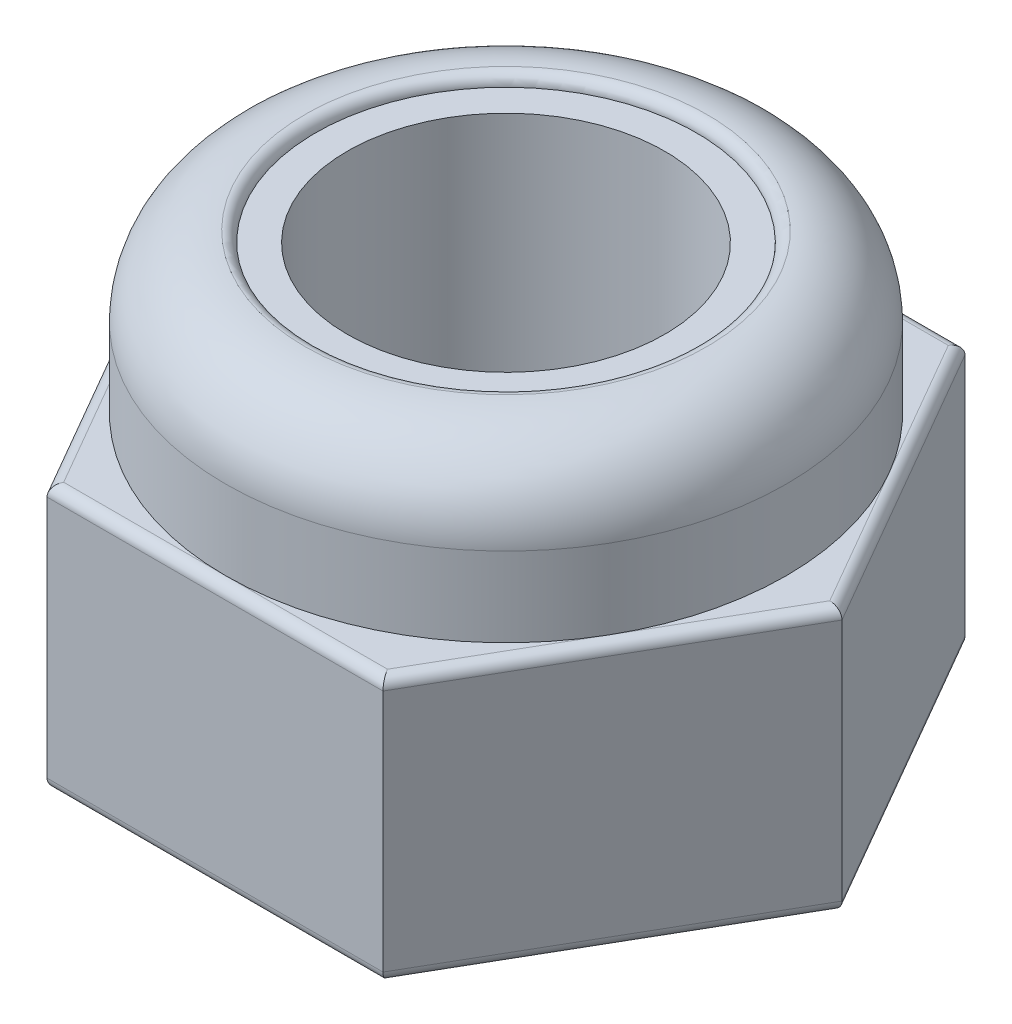
ISO-10303-21;
HEADER;
FILE_DESCRIPTION(('STEP AP214'),'2;1');
FILE_NAME('part.step','',(''),(''),'','','');
FILE_SCHEMA(('AUTOMOTIVE_DESIGN { 1 0 10303 214 1 1 1 1 }'));
ENDSEC;
DATA;
#1=APPLICATION_CONTEXT('core data for automotive mechanical design processes');
#2=APPLICATION_PROTOCOL_DEFINITION('international standard','automotive_design',2000,#1);
#3=PRODUCT_CONTEXT('',#1,'mechanical');
#4=PRODUCT('Part','Part','',(#3));
#5=PRODUCT_RELATED_PRODUCT_CATEGORY('part','',(#4));
#6=PRODUCT_DEFINITION_FORMATION('','',#4);
#7=PRODUCT_DEFINITION_CONTEXT('part definition',#1,'design');
#8=PRODUCT_DEFINITION('design','',#6,#7);
#9=PRODUCT_DEFINITION_SHAPE('','',#8);
#10=(LENGTH_UNIT() NAMED_UNIT(*) SI_UNIT(.MILLI.,.METRE.));
#11=(NAMED_UNIT(*) PLANE_ANGLE_UNIT() SI_UNIT($,.RADIAN.));
#12=(NAMED_UNIT(*) SI_UNIT($,.STERADIAN.) SOLID_ANGLE_UNIT());
#13=UNCERTAINTY_MEASURE_WITH_UNIT(LENGTH_MEASURE(1.E-05),#10,'distance_accuracy_value','');
#14=(GEOMETRIC_REPRESENTATION_CONTEXT(3) GLOBAL_UNCERTAINTY_ASSIGNED_CONTEXT((#13)) GLOBAL_UNIT_ASSIGNED_CONTEXT((#10,
#11,#12)) REPRESENTATION_CONTEXT('',''));
#15=CARTESIAN_POINT('',(0.,0.,0.));
#16=DIRECTION('',(0.,0.,1.));
#17=DIRECTION('',(1.,0.,0.));
#18=AXIS2_PLACEMENT_3D('',#15,#16,#17);
#19=CARTESIAN_POINT('',(0.,4.,0.));
#20=DIRECTION('',(0.,-1.,0.));
#21=DIRECTION('',(0.,0.,-1.));
#22=AXIS2_PLACEMENT_3D('',#19,#20,#21);
#23=CYLINDRICAL_SURFACE('',#22,1.5);
#24=CARTESIAN_POINT('',(0.,0.0999999999999998,0.));
#25=DIRECTION('',(0.,1.,0.));
#26=DIRECTION('',(0.,0.,1.));
#27=AXIS2_PLACEMENT_3D('',#24,#25,#26);
#28=CIRCLE('',#27,1.5);
#29=CARTESIAN_POINT('',(0.,0.0999999999999998,1.5));
#30=VERTEX_POINT('',#29);
#31=EDGE_CURVE('E172',#30,#30,#28,.F.);
#32=ORIENTED_EDGE('',*,*,#31,.T.);
#33=EDGE_LOOP('',(#32));
#34=FACE_BOUND('',#33,.T.);
#35=CARTESIAN_POINT('',(0.,3.9,0.));
#36=DIRECTION('',(0.,1.,0.));
#37=DIRECTION('',(0.,0.,1.));
#38=AXIS2_PLACEMENT_3D('',#35,#36,#37);
#39=CIRCLE('',#38,1.5);
#40=CARTESIAN_POINT('',(0.,3.9,1.5));
#41=VERTEX_POINT('',#40);
#42=EDGE_CURVE('E629',#41,#41,#39,.T.);
#43=ORIENTED_EDGE('',*,*,#42,.T.);
#44=EDGE_LOOP('',(#43));
#45=FACE_BOUND('',#44,.T.);
#46=ADVANCED_FACE('F33',(#34,#45),#23,.F.);
#47=CARTESIAN_POINT('',(0.,2.5,2.65));
#48=DIRECTION('',(0.,-1.,0.));
#49=DIRECTION('',(0.,0.,-1.));
#50=AXIS2_PLACEMENT_3D('',#47,#48,#49);
#51=PLANE('',#50);
#52=DIRECTION('',(-1.,0.,0.));
#53=VECTOR('',#52,1.);
#54=CARTESIAN_POINT('',(0.,2.5,2.65));
#55=LINE('',#54,#53);
#56=CARTESIAN_POINT('',(0.,2.5,2.65));
#57=VERTEX_POINT('',#56);
#58=CARTESIAN_POINT('',(1.52997821335251,2.5,2.65));
#59=VERTEX_POINT('',#58);
#60=EDGE_CURVE('E49',#57,#59,#55,.F.);
#61=ORIENTED_EDGE('',*,*,#60,.T.);
#62=DIRECTION('',(-0.5,0.,0.866025403784439));
#63=VECTOR('',#62,1.);
#64=CARTESIAN_POINT('',(1.14748366001438,2.5,3.3125));
#65=LINE('',#64,#63);
#66=CARTESIAN_POINT('',(2.29496732002876,2.5,1.325));
#67=VERTEX_POINT('',#66);
#68=EDGE_CURVE('E11',#59,#67,#65,.F.);
#69=ORIENTED_EDGE('',*,*,#68,.T.);
#70=CARTESIAN_POINT('',(0.,2.5,0.));
#71=DIRECTION('',(0.,1.,0.));
#72=DIRECTION('',(0.,0.,1.));
#73=AXIS2_PLACEMENT_3D('',#70,#71,#72);
#74=CIRCLE('',#73,2.65);
#75=EDGE_CURVE('E274',#57,#67,#74,.T.);
#76=ORIENTED_EDGE('',*,*,#75,.F.);
#77=EDGE_LOOP('',(#61,#69,#76));
#78=FACE_BOUND('',#77,.T.);
#79=ADVANCED_FACE('F279',(#78),#51,.F.);
#80=CARTESIAN_POINT('',(2.29496732002876,2.5,-1.325));
#81=VERTEX_POINT('',#80);
#82=EDGE_CURVE('E281',#67,#81,#74,.T.);
#83=ORIENTED_EDGE('',*,*,#82,.F.);
#84=DIRECTION('',(-0.5,0.,0.866025403784439));
#85=VECTOR('',#84,1.);
#86=CARTESIAN_POINT('',(1.14748366001438,2.5,3.3125));
#87=LINE('',#86,#85);
#88=CARTESIAN_POINT('',(3.05995642670502,2.5,0.));
#89=VERTEX_POINT('',#88);
#90=EDGE_CURVE('E42',#67,#89,#87,.F.);
#91=ORIENTED_EDGE('',*,*,#90,.T.);
#92=DIRECTION('',(0.5,0.,0.866025403784439));
#93=VECTOR('',#92,1.);
#94=CARTESIAN_POINT('',(3.44245098004314,2.5,0.6625));
#95=LINE('',#94,#93);
#96=EDGE_CURVE('E221',#89,#81,#95,.F.);
#97=ORIENTED_EDGE('',*,*,#96,.T.);
#98=EDGE_LOOP('',(#83,#91,#97));
#99=FACE_BOUND('',#98,.T.);
#100=ADVANCED_FACE('F348',(#99),#51,.F.);
#101=CARTESIAN_POINT('',(0.,2.5,-2.65));
#102=VERTEX_POINT('',#101);
#103=EDGE_CURVE('E285',#81,#102,#74,.T.);
#104=ORIENTED_EDGE('',*,*,#103,.F.);
#105=DIRECTION('',(0.5,0.,0.866025403784439));
#106=VECTOR('',#105,1.);
#107=CARTESIAN_POINT('',(3.44245098004314,2.5,0.6625));
#108=LINE('',#107,#106);
#109=CARTESIAN_POINT('',(1.52997821335251,2.5,-2.65));
#110=VERTEX_POINT('',#109);
#111=EDGE_CURVE('E219',#81,#110,#108,.F.);
#112=ORIENTED_EDGE('',*,*,#111,.T.);
#113=DIRECTION('',(1.,0.,0.));
#114=VECTOR('',#113,1.);
#115=CARTESIAN_POINT('',(0.,2.5,-2.65));
#116=LINE('',#115,#114);
#117=EDGE_CURVE('E216',#110,#102,#116,.F.);
#118=ORIENTED_EDGE('',*,*,#117,.T.);
#119=EDGE_LOOP('',(#104,#112,#118));
#120=FACE_BOUND('',#119,.T.);
#121=ADVANCED_FACE('F341',(#120),#51,.F.);
#122=CARTESIAN_POINT('',(-2.29496732002876,2.5,-1.325));
#123=VERTEX_POINT('',#122);
#124=EDGE_CURVE('E344',#102,#123,#74,.T.);
#125=ORIENTED_EDGE('',*,*,#124,.F.);
#126=DIRECTION('',(1.,0.,0.));
#127=VECTOR('',#126,1.);
#128=CARTESIAN_POINT('',(0.,2.5,-2.65));
#129=LINE('',#128,#127);
#130=CARTESIAN_POINT('',(-1.52997821335251,2.5,-2.65));
#131=VERTEX_POINT('',#130);
#132=EDGE_CURVE('E214',#102,#131,#129,.F.);
#133=ORIENTED_EDGE('',*,*,#132,.T.);
#134=DIRECTION('',(0.5,0.,-0.866025403784439));
#135=VECTOR('',#134,1.);
#136=CARTESIAN_POINT('',(-3.44245098004314,2.5,0.6625));
#137=LINE('',#136,#135);
#138=EDGE_CURVE('E210',#131,#123,#137,.F.);
#139=ORIENTED_EDGE('',*,*,#138,.T.);
#140=EDGE_LOOP('',(#125,#133,#139));
#141=FACE_BOUND('',#140,.T.);
#142=ADVANCED_FACE('F345',(#141),#51,.F.);
#143=DIRECTION('',(-0.5,0.,-0.866025403784439));
#144=VECTOR('',#143,1.);
#145=CARTESIAN_POINT('',(-1.14748366001438,2.5,3.3125));
#146=LINE('',#145,#144);
#147=CARTESIAN_POINT('',(-2.29496732002876,2.5,1.325));
#148=VERTEX_POINT('',#147);
#149=CARTESIAN_POINT('',(-1.52997821335251,2.5,2.65));
#150=VERTEX_POINT('',#149);
#151=EDGE_CURVE('E204',#148,#150,#146,.F.);
#152=ORIENTED_EDGE('',*,*,#151,.T.);
#153=DIRECTION('',(-1.,0.,0.));
#154=VECTOR('',#153,1.);
#155=CARTESIAN_POINT('',(0.,2.5,2.65));
#156=LINE('',#155,#154);
#157=EDGE_CURVE('E212',#150,#57,#156,.F.);
#158=ORIENTED_EDGE('',*,*,#157,.T.);
#159=EDGE_CURVE('E268',#148,#57,#74,.T.);
#160=ORIENTED_EDGE('',*,*,#159,.F.);
#161=EDGE_LOOP('',(#152,#158,#160));
#162=FACE_BOUND('',#161,.T.);
#163=ADVANCED_FACE('F267',(#162),#51,.F.);
#164=CARTESIAN_POINT('',(0.,0.,0.));
#165=DIRECTION('',(0.,1.,0.));
#166=DIRECTION('',(0.,0.,1.));
#167=AXIS2_PLACEMENT_3D('',#164,#165,#166);
#168=PLANE('',#167);
#169=CARTESIAN_POINT('',(0.,0.,0.));
#170=DIRECTION('',(0.,1.,0.));
#171=DIRECTION('',(0.,0.,1.));
#172=AXIS2_PLACEMENT_3D('',#169,#170,#171);
#173=CIRCLE('',#172,1.6);
#174=CARTESIAN_POINT('',(0.,0.,1.6));
#175=VERTEX_POINT('',#174);
#176=EDGE_CURVE('E169',#175,#175,#173,.T.);
#177=ORIENTED_EDGE('',*,*,#176,.T.);
#178=EDGE_LOOP('',(#177));
#179=FACE_BOUND('',#178,.T.);
#180=DIRECTION('',(-0.5,0.,-0.866025403784439));
#181=VECTOR('',#180,1.);
#182=CARTESIAN_POINT('',(2.29496732002876,0.,-1.325));
#183=LINE('',#182,#181);
#184=CARTESIAN_POINT('',(1.52997821335251,0.,-2.65));
#185=VERTEX_POINT('',#184);
#186=CARTESIAN_POINT('',(3.05995642670502,0.,0.));
#187=VERTEX_POINT('',#186);
#188=EDGE_CURVE('E168',#185,#187,#183,.F.);
#189=ORIENTED_EDGE('',*,*,#188,.T.);
#190=DIRECTION('',(0.5,0.,-0.866025403784439));
#191=VECTOR('',#190,1.);
#192=CARTESIAN_POINT('',(2.29496732002876,0.,1.325));
#193=LINE('',#192,#191);
#194=CARTESIAN_POINT('',(1.52997821335251,0.,2.65));
#195=VERTEX_POINT('',#194);
#196=EDGE_CURVE('E147',#187,#195,#193,.F.);
#197=ORIENTED_EDGE('',*,*,#196,.T.);
#198=DIRECTION('',(1.,0.,0.));
#199=VECTOR('',#198,1.);
#200=CARTESIAN_POINT('',(0.,0.,2.65));
#201=LINE('',#200,#199);
#202=CARTESIAN_POINT('',(-1.52997821335251,0.,2.65));
#203=VERTEX_POINT('',#202);
#204=EDGE_CURVE('E157',#195,#203,#201,.F.);
#205=ORIENTED_EDGE('',*,*,#204,.T.);
#206=DIRECTION('',(0.5,0.,0.866025403784439));
#207=VECTOR('',#206,1.);
#208=CARTESIAN_POINT('',(-2.29496732002876,0.,1.325));
#209=LINE('',#208,#207);
#210=CARTESIAN_POINT('',(-3.05995642670502,0.,0.));
#211=VERTEX_POINT('',#210);
#212=EDGE_CURVE('E163',#203,#211,#209,.F.);
#213=ORIENTED_EDGE('',*,*,#212,.T.);
#214=DIRECTION('',(-0.5,0.,0.866025403784439));
#215=VECTOR('',#214,1.);
#216=CARTESIAN_POINT('',(-2.29496732002876,0.,-1.325));
#217=LINE('',#216,#215);
#218=CARTESIAN_POINT('',(-1.52997821335251,0.,-2.65));
#219=VERTEX_POINT('',#218);
#220=EDGE_CURVE('E306',#211,#219,#217,.F.);
#221=ORIENTED_EDGE('',*,*,#220,.T.);
#222=DIRECTION('',(-1.,0.,0.));
#223=VECTOR('',#222,1.);
#224=CARTESIAN_POINT('',(0.,0.,-2.65));
#225=LINE('',#224,#223);
#226=EDGE_CURVE('E174',#219,#185,#225,.F.);
#227=ORIENTED_EDGE('',*,*,#226,.T.);
#228=EDGE_LOOP('',(#189,#197,#205,#213,#221,#227));
#229=FACE_BOUND('',#228,.T.);
#230=ADVANCED_FACE('F166',(#179,#229),#168,.F.);
#231=CARTESIAN_POINT('',(-1.58771324027147,4.,2.75));
#232=DIRECTION('',(0.,0.,-1.));
#233=DIRECTION('',(-1.,0.,0.));
#234=AXIS2_PLACEMENT_3D('',#231,#232,#233);
#235=PLANE('',#234);
#236=DIRECTION('',(0.,-1.,0.));
#237=VECTOR('',#236,1.);
#238=CARTESIAN_POINT('',(-1.58771324027147,4.,2.75));
#239=LINE('',#238,#237);
#240=CARTESIAN_POINT('',(-1.58771324027147,2.4,2.75));
#241=VERTEX_POINT('',#240);
#242=CARTESIAN_POINT('',(-1.58771324027147,0.0999999999999998,2.75));
#243=VERTEX_POINT('',#242);
#244=EDGE_CURVE('E283',#241,#243,#239,.T.);
#245=ORIENTED_EDGE('',*,*,#244,.T.);
#246=DIRECTION('',(1.,0.,0.));
#247=VECTOR('',#246,1.);
#248=CARTESIAN_POINT('',(-1.58771324027147,0.0999999999999998,2.75));
#249=LINE('',#248,#247);
#250=CARTESIAN_POINT('',(1.58771324027147,0.0999999999999998,2.75));
#251=VERTEX_POINT('',#250);
#252=EDGE_CURVE('E202',#243,#251,#249,.T.);
#253=ORIENTED_EDGE('',*,*,#252,.T.);
#254=DIRECTION('',(0.,-1.,0.));
#255=VECTOR('',#254,1.);
#256=CARTESIAN_POINT('',(1.58771324027147,4.,2.75));
#257=LINE('',#256,#255);
#258=CARTESIAN_POINT('',(1.58771324027147,2.4,2.75));
#259=VERTEX_POINT('',#258);
#260=EDGE_CURVE('E164',#259,#251,#257,.T.);
#261=ORIENTED_EDGE('',*,*,#260,.F.);
#262=DIRECTION('',(-1.,0.,0.));
#263=VECTOR('',#262,1.);
#264=CARTESIAN_POINT('',(-1.58771324027147,2.4,2.75));
#265=LINE('',#264,#263);
#266=EDGE_CURVE('E200',#259,#241,#265,.T.);
#267=ORIENTED_EDGE('',*,*,#266,.T.);
#268=EDGE_LOOP('',(#245,#253,#261,#267));
#269=FACE_BOUND('',#268,.T.);
#270=ADVANCED_FACE('F370',(#269),#235,.F.);
#271=CARTESIAN_POINT('',(1.58771324027147,4.,2.75));
#272=DIRECTION('',(-0.866025403784439,0.,-0.5));
#273=DIRECTION('',(-0.5,0.,0.866025403784439));
#274=AXIS2_PLACEMENT_3D('',#271,#272,#273);
#275=PLANE('',#274);
#276=ORIENTED_EDGE('',*,*,#260,.T.);
#277=DIRECTION('',(0.5,0.,-0.866025403784439));
#278=VECTOR('',#277,1.);
#279=CARTESIAN_POINT('',(1.58771324027147,0.0999999999999998,2.75));
#280=LINE('',#279,#278);
#281=CARTESIAN_POINT('',(3.17542648054294,0.0999999999999998,0.));
#282=VERTEX_POINT('',#281);
#283=EDGE_CURVE('E150',#251,#282,#280,.T.);
#284=ORIENTED_EDGE('',*,*,#283,.T.);
#285=DIRECTION('',(0.,-1.,0.));
#286=VECTOR('',#285,1.);
#287=CARTESIAN_POINT('',(3.17542648054294,4.,0.));
#288=LINE('',#287,#286);
#289=CARTESIAN_POINT('',(3.17542648054294,2.4,0.));
#290=VERTEX_POINT('',#289);
#291=EDGE_CURVE('E300',#290,#282,#288,.T.);
#292=ORIENTED_EDGE('',*,*,#291,.F.);
#293=DIRECTION('',(-0.5,0.,0.866025403784439));
#294=VECTOR('',#293,1.);
#295=CARTESIAN_POINT('',(1.58771324027147,2.4,2.75));
#296=LINE('',#295,#294);
#297=EDGE_CURVE('E180',#290,#259,#296,.T.);
#298=ORIENTED_EDGE('',*,*,#297,.T.);
#299=EDGE_LOOP('',(#276,#284,#292,#298));
#300=FACE_BOUND('',#299,.T.);
#301=ADVANCED_FACE('F321',(#300),#275,.F.);
#302=CARTESIAN_POINT('',(3.17542648054294,4.,0.));
#303=DIRECTION('',(-0.866025403784439,0.,0.5));
#304=DIRECTION('',(0.5,0.,0.866025403784439));
#305=AXIS2_PLACEMENT_3D('',#302,#303,#304);
#306=PLANE('',#305);
#307=ORIENTED_EDGE('',*,*,#291,.T.);
#308=DIRECTION('',(-0.5,0.,-0.866025403784439));
#309=VECTOR('',#308,1.);
#310=CARTESIAN_POINT('',(3.17542648054294,0.0999999999999998,0.));
#311=LINE('',#310,#309);
#312=CARTESIAN_POINT('',(1.58771324027147,0.0999999999999998,-2.75));
#313=VERTEX_POINT('',#312);
#314=EDGE_CURVE('E185',#282,#313,#311,.T.);
#315=ORIENTED_EDGE('',*,*,#314,.T.);
#316=DIRECTION('',(0.,-1.,0.));
#317=VECTOR('',#316,1.);
#318=CARTESIAN_POINT('',(1.58771324027147,4.,-2.75));
#319=LINE('',#318,#317);
#320=CARTESIAN_POINT('',(1.58771324027147,2.4,-2.75));
#321=VERTEX_POINT('',#320);
#322=EDGE_CURVE('E297',#321,#313,#319,.T.);
#323=ORIENTED_EDGE('',*,*,#322,.F.);
#324=DIRECTION('',(0.5,0.,0.866025403784439));
#325=VECTOR('',#324,1.);
#326=CARTESIAN_POINT('',(3.17542648054294,2.4,0.));
#327=LINE('',#326,#325);
#328=EDGE_CURVE('E183',#321,#290,#327,.T.);
#329=ORIENTED_EDGE('',*,*,#328,.T.);
#330=EDGE_LOOP('',(#307,#315,#323,#329));
#331=FACE_BOUND('',#330,.T.);
#332=ADVANCED_FACE('F323',(#331),#306,.F.);
#333=CARTESIAN_POINT('',(1.58771324027147,4.,-2.75));
#334=DIRECTION('',(0.,0.,1.));
#335=DIRECTION('',(1.,0.,0.));
#336=AXIS2_PLACEMENT_3D('',#333,#334,#335);
#337=PLANE('',#336);
#338=ORIENTED_EDGE('',*,*,#322,.T.);
#339=DIRECTION('',(-1.,0.,0.));
#340=VECTOR('',#339,1.);
#341=CARTESIAN_POINT('',(1.58771324027147,0.0999999999999998,-2.75));
#342=LINE('',#341,#340);
#343=CARTESIAN_POINT('',(-1.58771324027147,0.0999999999999998,-2.75));
#344=VERTEX_POINT('',#343);
#345=EDGE_CURVE('E190',#313,#344,#342,.T.);
#346=ORIENTED_EDGE('',*,*,#345,.T.);
#347=DIRECTION('',(0.,-1.,0.));
#348=VECTOR('',#347,1.);
#349=CARTESIAN_POINT('',(-1.58771324027147,4.,-2.75));
#350=LINE('',#349,#348);
#351=CARTESIAN_POINT('',(-1.58771324027147,2.4,-2.75));
#352=VERTEX_POINT('',#351);
#353=EDGE_CURVE('E294',#352,#344,#350,.T.);
#354=ORIENTED_EDGE('',*,*,#353,.F.);
#355=DIRECTION('',(1.,0.,0.));
#356=VECTOR('',#355,1.);
#357=CARTESIAN_POINT('',(1.58771324027147,2.4,-2.75));
#358=LINE('',#357,#356);
#359=EDGE_CURVE('E187',#352,#321,#358,.T.);
#360=ORIENTED_EDGE('',*,*,#359,.T.);
#361=EDGE_LOOP('',(#338,#346,#354,#360));
#362=FACE_BOUND('',#361,.T.);
#363=ADVANCED_FACE('F333',(#362),#337,.F.);
#364=CARTESIAN_POINT('',(-1.58771324027147,4.,-2.75));
#365=DIRECTION('',(0.866025403784439,0.,0.5));
#366=DIRECTION('',(0.5,0.,-0.866025403784439));
#367=AXIS2_PLACEMENT_3D('',#364,#365,#366);
#368=PLANE('',#367);
#369=ORIENTED_EDGE('',*,*,#353,.T.);
#370=DIRECTION('',(-0.5,0.,0.866025403784439));
#371=VECTOR('',#370,1.);
#372=CARTESIAN_POINT('',(-1.58771324027147,0.0999999999999998,-2.75));
#373=LINE('',#372,#371);
#374=CARTESIAN_POINT('',(-3.17542648054294,0.0999999999999998,0.));
#375=VERTEX_POINT('',#374);
#376=EDGE_CURVE('E194',#344,#375,#373,.T.);
#377=ORIENTED_EDGE('',*,*,#376,.T.);
#378=DIRECTION('',(0.,-1.,0.));
#379=VECTOR('',#378,1.);
#380=CARTESIAN_POINT('',(-3.17542648054294,4.,0.));
#381=LINE('',#380,#379);
#382=CARTESIAN_POINT('',(-3.17542648054294,2.4,0.));
#383=VERTEX_POINT('',#382);
#384=EDGE_CURVE('E291',#383,#375,#381,.T.);
#385=ORIENTED_EDGE('',*,*,#384,.F.);
#386=DIRECTION('',(0.5,0.,-0.866025403784439));
#387=VECTOR('',#386,1.);
#388=CARTESIAN_POINT('',(-1.58771324027147,2.4,-2.75));
#389=LINE('',#388,#387);
#390=EDGE_CURVE('E192',#383,#352,#389,.T.);
#391=ORIENTED_EDGE('',*,*,#390,.T.);
#392=EDGE_LOOP('',(#369,#377,#385,#391));
#393=FACE_BOUND('',#392,.T.);
#394=ADVANCED_FACE('F375',(#393),#368,.F.);
#395=CARTESIAN_POINT('',(-3.17542648054294,4.,0.));
#396=DIRECTION('',(0.866025403784439,0.,-0.5));
#397=DIRECTION('',(-0.5,0.,-0.866025403784439));
#398=AXIS2_PLACEMENT_3D('',#395,#396,#397);
#399=PLANE('',#398);
#400=ORIENTED_EDGE('',*,*,#384,.T.);
#401=DIRECTION('',(0.5,0.,0.866025403784439));
#402=VECTOR('',#401,1.);
#403=CARTESIAN_POINT('',(-3.17542648054294,0.0999999999999998,0.));
#404=LINE('',#403,#402);
#405=EDGE_CURVE('E198',#375,#243,#404,.T.);
#406=ORIENTED_EDGE('',*,*,#405,.T.);
#407=ORIENTED_EDGE('',*,*,#244,.F.);
#408=DIRECTION('',(-0.5,0.,-0.866025403784439));
#409=VECTOR('',#408,1.);
#410=CARTESIAN_POINT('',(-3.17542648054294,2.4,0.));
#411=LINE('',#410,#409);
#412=EDGE_CURVE('E196',#241,#383,#411,.T.);
#413=ORIENTED_EDGE('',*,*,#412,.T.);
#414=EDGE_LOOP('',(#400,#406,#407,#413));
#415=FACE_BOUND('',#414,.T.);
#416=ADVANCED_FACE('F372',(#415),#399,.F.);
#417=EDGE_CURVE('E277',#123,#148,#74,.T.);
#418=ORIENTED_EDGE('',*,*,#417,.F.);
#419=DIRECTION('',(0.5,0.,-0.866025403784439));
#420=VECTOR('',#419,1.);
#421=CARTESIAN_POINT('',(-3.44245098004314,2.5,0.6625));
#422=LINE('',#421,#420);
#423=CARTESIAN_POINT('',(-3.05995642670502,2.5,0.));
#424=VERTEX_POINT('',#423);
#425=EDGE_CURVE('E208',#123,#424,#422,.F.);
#426=ORIENTED_EDGE('',*,*,#425,.T.);
#427=DIRECTION('',(-0.5,0.,-0.866025403784439));
#428=VECTOR('',#427,1.);
#429=CARTESIAN_POINT('',(-1.14748366001438,2.5,3.3125));
#430=LINE('',#429,#428);
#431=EDGE_CURVE('E206',#424,#148,#430,.F.);
#432=ORIENTED_EDGE('',*,*,#431,.T.);
#433=EDGE_LOOP('',(#418,#426,#432));
#434=FACE_BOUND('',#433,.T.);
#435=ADVANCED_FACE('F355',(#434),#51,.F.);
#436=CARTESIAN_POINT('',(0.,3.25,0.));
#437=DIRECTION('',(0.,1.,0.));
#438=DIRECTION('',(0.,0.,1.));
#439=AXIS2_PLACEMENT_3D('',#436,#437,#438);
#440=TOROIDAL_SURFACE('',#439,1.9,0.75);
#441=CARTESIAN_POINT('',(0.,4.,0.));
#442=DIRECTION('',(0.,1.,0.));
#443=DIRECTION('',(0.,0.,1.));
#444=AXIS2_PLACEMENT_3D('',#441,#442,#443);
#445=CIRCLE('',#444,1.9);
#446=CARTESIAN_POINT('',(0.,4.,1.9));
#447=VERTEX_POINT('',#446);
#448=EDGE_CURVE('E280',#447,#447,#445,.T.);
#449=ORIENTED_EDGE('',*,*,#448,.F.);
#450=EDGE_LOOP('',(#449));
#451=FACE_BOUND('',#450,.T.);
#452=CARTESIAN_POINT('',(0.,3.25,0.));
#453=DIRECTION('',(0.,1.,0.));
#454=DIRECTION('',(0.,0.,1.));
#455=AXIS2_PLACEMENT_3D('',#452,#453,#454);
#456=CIRCLE('',#455,2.65);
#457=CARTESIAN_POINT('',(0.,3.25,2.65));
#458=VERTEX_POINT('',#457);
#459=EDGE_CURVE('E235',#458,#458,#456,.T.);
#460=ORIENTED_EDGE('',*,*,#459,.T.);
#461=EDGE_LOOP('',(#460));
#462=FACE_BOUND('',#461,.T.);
#463=ADVANCED_FACE('F367',(#451,#462),#440,.T.);
#464=CARTESIAN_POINT('',(0.,4.,0.));
#465=DIRECTION('',(0.,1.,0.));
#466=DIRECTION('',(0.,0.,1.));
#467=AXIS2_PLACEMENT_3D('',#464,#465,#466);
#468=CYLINDRICAL_SURFACE('',#467,2.65);
#469=ORIENTED_EDGE('',*,*,#459,.F.);
#470=EDGE_LOOP('',(#469));
#471=FACE_BOUND('',#470,.T.);
#472=ORIENTED_EDGE('',*,*,#75,.T.);
#473=ORIENTED_EDGE('',*,*,#82,.T.);
#474=ORIENTED_EDGE('',*,*,#103,.T.);
#475=ORIENTED_EDGE('',*,*,#124,.T.);
#476=ORIENTED_EDGE('',*,*,#417,.T.);
#477=ORIENTED_EDGE('',*,*,#159,.T.);
#478=EDGE_LOOP('',(#472,#473,#474,#475,#476,#477));
#479=FACE_BOUND('',#478,.T.);
#480=ADVANCED_FACE('F272',(#471,#479),#468,.T.);
#481=CARTESIAN_POINT('',(0.,0.0999999999999998,0.));
#482=DIRECTION('',(0.,1.,0.));
#483=DIRECTION('',(0.,0.,1.));
#484=AXIS2_PLACEMENT_3D('',#481,#482,#483);
#485=TOROIDAL_SURFACE('',#484,1.6,0.1);
#486=ORIENTED_EDGE('',*,*,#31,.F.);
#487=EDGE_LOOP('',(#486));
#488=FACE_BOUND('',#487,.T.);
#489=ORIENTED_EDGE('',*,*,#176,.F.);
#490=EDGE_LOOP('',(#489));
#491=FACE_BOUND('',#490,.T.);
#492=ADVANCED_FACE('F389',(#488,#491),#485,.T.);
#493=CARTESIAN_POINT('',(-1.50111069989303,0.0999999999999998,-2.7));
#494=DIRECTION('',(-0.5,0.,0.866025403784439));
#495=DIRECTION('',(0.866025403784439,0.,0.5));
#496=AXIS2_PLACEMENT_3D('',#493,#494,#495);
#497=CYLINDRICAL_SURFACE('',#496,0.1);
#498=CARTESIAN_POINT('',(-1.52997821335251,0.0999999999999998,-2.65));
#499=DIRECTION('',(-0.866025403784439,0.,0.5));
#500=DIRECTION('',(0.5,0.,0.866025403784439));
#501=AXIS2_PLACEMENT_3D('',#498,#499,#500);
#502=ELLIPSE('',#501,0.115470053837925,0.1);
#503=EDGE_CURVE('E229',#219,#344,#502,.F.);
#504=ORIENTED_EDGE('',*,*,#503,.F.);
#505=ORIENTED_EDGE('',*,*,#220,.F.);
#506=CARTESIAN_POINT('',(-3.05995642670502,0.0999999999999998,0.));
#507=DIRECTION('',(0.,0.,1.));
#508=DIRECTION('',(1.,0.,0.));
#509=AXIS2_PLACEMENT_3D('',#506,#507,#508);
#510=ELLIPSE('',#509,0.115470053837925,0.1);
#511=EDGE_CURVE('E232',#375,#211,#510,.T.);
#512=ORIENTED_EDGE('',*,*,#511,.F.);
#513=ORIENTED_EDGE('',*,*,#376,.F.);
#514=EDGE_LOOP('',(#504,#505,#512,#513));
#515=FACE_BOUND('',#514,.T.);
#516=ADVANCED_FACE('F392',(#515),#497,.T.);
#517=CARTESIAN_POINT('',(-3.0888239401645,0.0999999999999998,-0.0500000000000006));
#518=DIRECTION('',(0.5,0.,0.866025403784439));
#519=DIRECTION('',(0.866025403784439,0.,-0.5));
#520=AXIS2_PLACEMENT_3D('',#517,#518,#519);
#521=CYLINDRICAL_SURFACE('',#520,0.1);
#522=ORIENTED_EDGE('',*,*,#511,.T.);
#523=ORIENTED_EDGE('',*,*,#212,.F.);
#524=CARTESIAN_POINT('',(-1.52997821335251,0.0999999999999998,2.65));
#525=DIRECTION('',(0.866025403784438,0.,0.5));
#526=DIRECTION('',(0.5,0.,-0.866025403784439));
#527=AXIS2_PLACEMENT_3D('',#524,#525,#526);
#528=ELLIPSE('',#527,0.115470053837925,0.1);
#529=EDGE_CURVE('E160',#243,#203,#528,.T.);
#530=ORIENTED_EDGE('',*,*,#529,.F.);
#531=ORIENTED_EDGE('',*,*,#405,.F.);
#532=EDGE_LOOP('',(#522,#523,#530,#531));
#533=FACE_BOUND('',#532,.T.);
#534=ADVANCED_FACE('F402',(#533),#521,.T.);
#535=CARTESIAN_POINT('',(1.58771324027147,0.0999999999999998,-2.65));
#536=DIRECTION('',(-1.,0.,0.));
#537=DIRECTION('',(0.,0.,1.));
#538=AXIS2_PLACEMENT_3D('',#535,#536,#537);
#539=CYLINDRICAL_SURFACE('',#538,0.1);
#540=ORIENTED_EDGE('',*,*,#503,.T.);
#541=ORIENTED_EDGE('',*,*,#345,.F.);
#542=CARTESIAN_POINT('',(1.52997821335251,0.0999999999999998,-2.65));
#543=DIRECTION('',(-0.866025403784439,0.,-0.5));
#544=DIRECTION('',(-0.5,0.,0.866025403784439));
#545=AXIS2_PLACEMENT_3D('',#542,#543,#544);
#546=ELLIPSE('',#545,0.115470053837925,0.1);
#547=EDGE_CURVE('E153',#185,#313,#546,.F.);
#548=ORIENTED_EDGE('',*,*,#547,.F.);
#549=ORIENTED_EDGE('',*,*,#226,.F.);
#550=EDGE_LOOP('',(#540,#541,#548,#549));
#551=FACE_BOUND('',#550,.T.);
#552=ADVANCED_FACE('F313',(#551),#539,.T.);
#553=CARTESIAN_POINT('',(-1.58771324027147,0.0999999999999998,2.65));
#554=DIRECTION('',(1.,0.,0.));
#555=DIRECTION('',(0.,0.,-1.));
#556=AXIS2_PLACEMENT_3D('',#553,#554,#555);
#557=CYLINDRICAL_SURFACE('',#556,0.1);
#558=ORIENTED_EDGE('',*,*,#529,.T.);
#559=ORIENTED_EDGE('',*,*,#204,.F.);
#560=CARTESIAN_POINT('',(1.52997821335251,0.0999999999999998,2.65));
#561=DIRECTION('',(0.866025403784439,0.,-0.5));
#562=DIRECTION('',(0.5,0.,0.866025403784439));
#563=AXIS2_PLACEMENT_3D('',#560,#561,#562);
#564=ELLIPSE('',#563,0.115470053837925,0.1);
#565=EDGE_CURVE('E143',#251,#195,#564,.T.);
#566=ORIENTED_EDGE('',*,*,#565,.F.);
#567=ORIENTED_EDGE('',*,*,#252,.F.);
#568=EDGE_LOOP('',(#558,#559,#566,#567));
#569=FACE_BOUND('',#568,.T.);
#570=ADVANCED_FACE('F158',(#569),#557,.T.);
#571=CARTESIAN_POINT('',(3.0888239401645,0.0999999999999998,0.0500000000000004));
#572=DIRECTION('',(-0.5,0.,-0.866025403784439));
#573=DIRECTION('',(-0.866025403784439,0.,0.5));
#574=AXIS2_PLACEMENT_3D('',#571,#572,#573);
#575=CYLINDRICAL_SURFACE('',#574,0.1);
#576=ORIENTED_EDGE('',*,*,#547,.T.);
#577=ORIENTED_EDGE('',*,*,#314,.F.);
#578=CARTESIAN_POINT('',(3.05995642670502,0.0999999999999998,0.));
#579=DIRECTION('',(0.,0.,-1.));
#580=DIRECTION('',(-1.,0.,0.));
#581=AXIS2_PLACEMENT_3D('',#578,#579,#580);
#582=ELLIPSE('',#581,0.115470053837925,0.1);
#583=EDGE_CURVE('E154',#187,#282,#582,.F.);
#584=ORIENTED_EDGE('',*,*,#583,.F.);
#585=ORIENTED_EDGE('',*,*,#188,.F.);
#586=EDGE_LOOP('',(#576,#577,#584,#585));
#587=FACE_BOUND('',#586,.T.);
#588=ADVANCED_FACE('F316',(#587),#575,.T.);
#589=CARTESIAN_POINT('',(1.50111069989303,0.0999999999999998,2.7));
#590=DIRECTION('',(0.5,0.,-0.866025403784439));
#591=DIRECTION('',(-0.866025403784439,0.,-0.5));
#592=AXIS2_PLACEMENT_3D('',#589,#590,#591);
#593=CYLINDRICAL_SURFACE('',#592,0.1);
#594=ORIENTED_EDGE('',*,*,#565,.T.);
#595=ORIENTED_EDGE('',*,*,#196,.F.);
#596=ORIENTED_EDGE('',*,*,#583,.T.);
#597=ORIENTED_EDGE('',*,*,#283,.F.);
#598=EDGE_LOOP('',(#594,#595,#596,#597));
#599=FACE_BOUND('',#598,.T.);
#600=ADVANCED_FACE('F145',(#599),#593,.T.);
#601=CARTESIAN_POINT('',(-1.58771324027147,2.4,2.65));
#602=DIRECTION('',(-1.,0.,0.));
#603=DIRECTION('',(0.,0.,1.));
#604=AXIS2_PLACEMENT_3D('',#601,#602,#603);
#605=CYLINDRICAL_SURFACE('',#604,0.1);
#606=ORIENTED_EDGE('',*,*,#60,.F.);
#607=ORIENTED_EDGE('',*,*,#157,.F.);
#608=CARTESIAN_POINT('',(-1.52997821335251,2.4,2.65));
#609=DIRECTION('',(-0.866025403784438,0.,-0.5));
#610=DIRECTION('',(0.5,0.,-0.866025403784439));
#611=AXIS2_PLACEMENT_3D('',#608,#609,#610);
#612=ELLIPSE('',#611,0.115470053837925,0.1);
#613=EDGE_CURVE('E37',#241,#150,#612,.T.);
#614=ORIENTED_EDGE('',*,*,#613,.F.);
#615=ORIENTED_EDGE('',*,*,#266,.F.);
#616=CARTESIAN_POINT('',(1.52997821335251,2.4,2.65));
#617=DIRECTION('',(-0.866025403784439,0.,0.5));
#618=DIRECTION('',(-0.5,0.,-0.866025403784439));
#619=AXIS2_PLACEMENT_3D('',#616,#617,#618);
#620=ELLIPSE('',#619,0.115470053837925,0.1);
#621=EDGE_CURVE('E247',#59,#259,#620,.F.);
#622=ORIENTED_EDGE('',*,*,#621,.F.);
#623=EDGE_LOOP('',(#606,#607,#614,#615,#622));
#624=FACE_BOUND('',#623,.T.);
#625=ADVANCED_FACE('F263',(#624),#605,.T.);
#626=CARTESIAN_POINT('',(-3.0888239401645,2.4,-0.0500000000000004));
#627=DIRECTION('',(-0.5,0.,-0.866025403784439));
#628=DIRECTION('',(-0.866025403784439,0.,0.5));
#629=AXIS2_PLACEMENT_3D('',#626,#627,#628);
#630=CYLINDRICAL_SURFACE('',#629,0.1);
#631=ORIENTED_EDGE('',*,*,#151,.F.);
#632=ORIENTED_EDGE('',*,*,#431,.F.);
#633=CARTESIAN_POINT('',(-3.05995642670502,2.4,0.));
#634=DIRECTION('',(0.,0.,-1.));
#635=DIRECTION('',(-1.,0.,0.));
#636=AXIS2_PLACEMENT_3D('',#633,#634,#635);
#637=ELLIPSE('',#636,0.115470053837925,0.1);
#638=EDGE_CURVE('E245',#383,#424,#637,.T.);
#639=ORIENTED_EDGE('',*,*,#638,.F.);
#640=ORIENTED_EDGE('',*,*,#412,.F.);
#641=ORIENTED_EDGE('',*,*,#613,.T.);
#642=EDGE_LOOP('',(#631,#632,#639,#640,#641));
#643=FACE_BOUND('',#642,.T.);
#644=ADVANCED_FACE('F257',(#643),#630,.T.);
#645=CARTESIAN_POINT('',(1.50111069989303,2.4,2.7));
#646=DIRECTION('',(-0.5,0.,0.866025403784439));
#647=DIRECTION('',(0.866025403784439,0.,0.5));
#648=AXIS2_PLACEMENT_3D('',#645,#646,#647);
#649=CYLINDRICAL_SURFACE('',#648,0.1);
#650=ORIENTED_EDGE('',*,*,#621,.T.);
#651=ORIENTED_EDGE('',*,*,#297,.F.);
#652=CARTESIAN_POINT('',(3.05995642670502,2.4,0.));
#653=DIRECTION('',(0.,0.,1.));
#654=DIRECTION('',(1.,0.,0.));
#655=AXIS2_PLACEMENT_3D('',#652,#653,#654);
#656=ELLIPSE('',#655,0.115470053837925,0.1);
#657=EDGE_CURVE('E242',#89,#290,#656,.F.);
#658=ORIENTED_EDGE('',*,*,#657,.F.);
#659=ORIENTED_EDGE('',*,*,#90,.F.);
#660=ORIENTED_EDGE('',*,*,#68,.F.);
#661=EDGE_LOOP('',(#650,#651,#658,#659,#660));
#662=FACE_BOUND('',#661,.T.);
#663=ADVANCED_FACE('F417',(#662),#649,.T.);
#664=CARTESIAN_POINT('',(-1.50111069989303,2.4,-2.7));
#665=DIRECTION('',(0.5,0.,-0.866025403784439));
#666=DIRECTION('',(-0.866025403784439,0.,-0.5));
#667=AXIS2_PLACEMENT_3D('',#664,#665,#666);
#668=CYLINDRICAL_SURFACE('',#667,0.1);
#669=ORIENTED_EDGE('',*,*,#425,.F.);
#670=ORIENTED_EDGE('',*,*,#138,.F.);
#671=CARTESIAN_POINT('',(-1.52997821335251,2.4,-2.65));
#672=DIRECTION('',(0.866025403784439,0.,-0.5));
#673=DIRECTION('',(-0.5,0.,-0.866025403784439));
#674=AXIS2_PLACEMENT_3D('',#671,#672,#673);
#675=ELLIPSE('',#674,0.115470053837925,0.1);
#676=EDGE_CURVE('E238',#352,#131,#675,.T.);
#677=ORIENTED_EDGE('',*,*,#676,.F.);
#678=ORIENTED_EDGE('',*,*,#390,.F.);
#679=ORIENTED_EDGE('',*,*,#638,.T.);
#680=EDGE_LOOP('',(#669,#670,#677,#678,#679));
#681=FACE_BOUND('',#680,.T.);
#682=ADVANCED_FACE('F414',(#681),#668,.T.);
#683=CARTESIAN_POINT('',(3.0888239401645,2.4,0.0500000000000006));
#684=DIRECTION('',(0.5,0.,0.866025403784439));
#685=DIRECTION('',(0.866025403784439,0.,-0.5));
#686=AXIS2_PLACEMENT_3D('',#683,#684,#685);
#687=CYLINDRICAL_SURFACE('',#686,0.1);
#688=ORIENTED_EDGE('',*,*,#657,.T.);
#689=ORIENTED_EDGE('',*,*,#328,.F.);
#690=CARTESIAN_POINT('',(1.52997821335251,2.4,-2.65));
#691=DIRECTION('',(0.866025403784439,0.,0.5));
#692=DIRECTION('',(-0.5,0.,0.866025403784439));
#693=AXIS2_PLACEMENT_3D('',#690,#691,#692);
#694=ELLIPSE('',#693,0.115470053837925,0.1);
#695=EDGE_CURVE('E236',#110,#321,#694,.F.);
#696=ORIENTED_EDGE('',*,*,#695,.F.);
#697=ORIENTED_EDGE('',*,*,#111,.F.);
#698=ORIENTED_EDGE('',*,*,#96,.F.);
#699=EDGE_LOOP('',(#688,#689,#696,#697,#698));
#700=FACE_BOUND('',#699,.T.);
#701=ADVANCED_FACE('F327',(#700),#687,.T.);
#702=CARTESIAN_POINT('',(1.58771324027147,2.4,-2.65));
#703=DIRECTION('',(1.,0.,0.));
#704=DIRECTION('',(0.,0.,-1.));
#705=AXIS2_PLACEMENT_3D('',#702,#703,#704);
#706=CYLINDRICAL_SURFACE('',#705,0.1);
#707=ORIENTED_EDGE('',*,*,#132,.F.);
#708=ORIENTED_EDGE('',*,*,#117,.F.);
#709=ORIENTED_EDGE('',*,*,#695,.T.);
#710=ORIENTED_EDGE('',*,*,#359,.F.);
#711=ORIENTED_EDGE('',*,*,#676,.T.);
#712=EDGE_LOOP('',(#707,#708,#709,#710,#711));
#713=FACE_BOUND('',#712,.T.);
#714=ADVANCED_FACE('F336',(#713),#706,.T.);
#715=CARTESIAN_POINT('',(0.,3.9,0.));
#716=DIRECTION('',(0.,1.,0.));
#717=DIRECTION('',(0.,0.,1.));
#718=AXIS2_PLACEMENT_3D('',#715,#716,#717);
#719=PLANE('',#718);
#720=ORIENTED_EDGE('',*,*,#42,.F.);
#721=EDGE_LOOP('',(#720));
#722=FACE_BOUND('',#721,.T.);
#723=CARTESIAN_POINT('',(0.,3.9,0.));
#724=DIRECTION('',(0.,1.,0.));
#725=DIRECTION('',(0.,0.,1.));
#726=AXIS2_PLACEMENT_3D('',#723,#724,#725);
#727=CIRCLE('',#726,1.8);
#728=CARTESIAN_POINT('',(0.,3.9,1.8));
#729=VERTEX_POINT('',#728);
#730=EDGE_CURVE('E239',#729,#729,#727,.T.);
#731=ORIENTED_EDGE('',*,*,#730,.T.);
#732=EDGE_LOOP('',(#731));
#733=FACE_BOUND('',#732,.T.);
#734=ADVANCED_FACE('F411',(#722,#733),#719,.T.);
#735=CARTESIAN_POINT('',(0.,3.9,0.));
#736=DIRECTION('',(0.,1.,0.));
#737=DIRECTION('',(0.,0.,1.));
#738=AXIS2_PLACEMENT_3D('',#735,#736,#737);
#739=TOROIDAL_SURFACE('',#738,1.9,0.1);
#740=ORIENTED_EDGE('',*,*,#448,.T.);
#741=EDGE_LOOP('',(#740));
#742=FACE_BOUND('',#741,.T.);
#743=ORIENTED_EDGE('',*,*,#730,.F.);
#744=EDGE_LOOP('',(#743));
#745=FACE_BOUND('',#744,.T.);
#746=ADVANCED_FACE('F35',(#742,#745),#739,.T.);
#747=CLOSED_SHELL('',(#46,#79,#100,#121,#142,#163,#230,#270,#301,#332,#363,#394,#416,#435,#463,
#480,#492,#516,#534,#552,#570,#588,#600,#625,#644,#663,#682,#701,#714,#734,#746));
#748=MANIFOLD_SOLID_BREP('B2',#747);
#749=ADVANCED_BREP_SHAPE_REPRESENTATION('',(#18,#748),#14);
#750=SHAPE_DEFINITION_REPRESENTATION(#9,#749);
ENDSEC;
END-ISO-10303-21;
